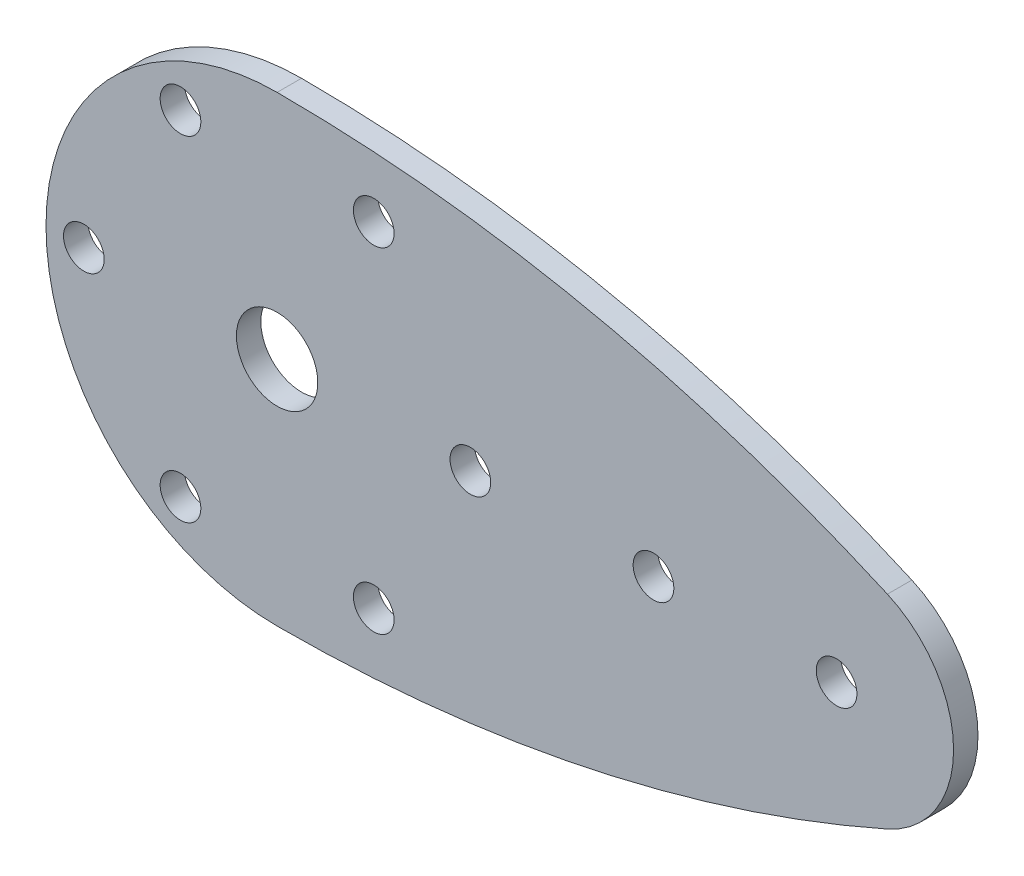
ISO-10303-21;
HEADER;
FILE_DESCRIPTION(('STEP AP214'),'2;1');
FILE_NAME('part.step','',(''),(''),'','','');
FILE_SCHEMA(('AUTOMOTIVE_DESIGN { 1 0 10303 214 1 1 1 1 }'));
ENDSEC;
DATA;
#1=APPLICATION_CONTEXT('core data for automotive mechanical design processes');
#2=APPLICATION_PROTOCOL_DEFINITION('international standard','automotive_design',2000,#1);
#3=PRODUCT_CONTEXT('',#1,'mechanical');
#4=PRODUCT('Part','Part','',(#3));
#5=PRODUCT_RELATED_PRODUCT_CATEGORY('part','',(#4));
#6=PRODUCT_DEFINITION_FORMATION('','',#4);
#7=PRODUCT_DEFINITION_CONTEXT('part definition',#1,'design');
#8=PRODUCT_DEFINITION('design','',#6,#7);
#9=PRODUCT_DEFINITION_SHAPE('','',#8);
#10=(LENGTH_UNIT() NAMED_UNIT(*) SI_UNIT(.MILLI.,.METRE.));
#11=(NAMED_UNIT(*) PLANE_ANGLE_UNIT() SI_UNIT($,.RADIAN.));
#12=(NAMED_UNIT(*) SI_UNIT($,.STERADIAN.) SOLID_ANGLE_UNIT());
#13=UNCERTAINTY_MEASURE_WITH_UNIT(LENGTH_MEASURE(1.E-05),#10,'distance_accuracy_value','');
#14=(GEOMETRIC_REPRESENTATION_CONTEXT(3) GLOBAL_UNCERTAINTY_ASSIGNED_CONTEXT((#13)) GLOBAL_UNIT_ASSIGNED_CONTEXT((#10,
#11,#12)) REPRESENTATION_CONTEXT('',''));
#15=CARTESIAN_POINT('',(0.,0.,0.));
#16=DIRECTION('',(0.,0.,1.));
#17=DIRECTION('',(1.,0.,0.));
#18=AXIS2_PLACEMENT_3D('',#15,#16,#17);
#19=CARTESIAN_POINT('',(27.3635313531353,0.,-0.5));
#20=DIRECTION('',(0.,0.,-1.));
#21=DIRECTION('',(-1.,0.,0.));
#22=AXIS2_PLACEMENT_3D('',#19,#20,#21);
#23=PLANE('',#22);
#24=CARTESIAN_POINT('',(68.75,0.,-0.5));
#25=DIRECTION('',(0.,0.,-1.));
#26=DIRECTION('',(-1.,0.,0.));
#27=AXIS2_PLACEMENT_3D('',#24,#25,#26);
#28=CIRCLE('',#27,2.5);
#29=CARTESIAN_POINT('',(66.25,0.,-0.5));
#30=VERTEX_POINT('',#29);
#31=EDGE_CURVE('E110',#30,#30,#28,.F.);
#32=ORIENTED_EDGE('',*,*,#31,.T.);
#33=EDGE_LOOP('',(#32));
#34=FACE_BOUND('',#33,.T.);
#35=CARTESIAN_POINT('',(11.875,20.5681033398804,-0.5));
#36=DIRECTION('',(0.,0.,-1.));
#37=DIRECTION('',(-1.,0.,0.));
#38=AXIS2_PLACEMENT_3D('',#35,#36,#37);
#39=CIRCLE('',#38,2.5);
#40=CARTESIAN_POINT('',(9.375,20.5681033398804,-0.5));
#41=VERTEX_POINT('',#40);
#42=EDGE_CURVE('E113',#41,#41,#39,.F.);
#43=ORIENTED_EDGE('',*,*,#42,.T.);
#44=EDGE_LOOP('',(#43));
#45=FACE_BOUND('',#44,.T.);
#46=CARTESIAN_POINT('',(-23.75,0.,-0.5));
#47=DIRECTION('',(0.,0.,-1.));
#48=DIRECTION('',(-1.,0.,0.));
#49=AXIS2_PLACEMENT_3D('',#46,#47,#48);
#50=CIRCLE('',#49,2.5);
#51=CARTESIAN_POINT('',(-26.25,0.,-0.5));
#52=VERTEX_POINT('',#51);
#53=EDGE_CURVE('E116',#52,#52,#50,.F.);
#54=ORIENTED_EDGE('',*,*,#53,.T.);
#55=EDGE_LOOP('',(#54));
#56=FACE_BOUND('',#55,.T.);
#57=CARTESIAN_POINT('',(-11.875,-20.5681033398804,-0.5));
#58=DIRECTION('',(0.,0.,-1.));
#59=DIRECTION('',(-1.,0.,0.));
#60=AXIS2_PLACEMENT_3D('',#57,#58,#59);
#61=CIRCLE('',#60,2.5);
#62=CARTESIAN_POINT('',(-14.375,-20.5681033398804,-0.5));
#63=VERTEX_POINT('',#62);
#64=EDGE_CURVE('E119',#63,#63,#61,.F.);
#65=ORIENTED_EDGE('',*,*,#64,.T.);
#66=EDGE_LOOP('',(#65));
#67=FACE_BOUND('',#66,.T.);
#68=CARTESIAN_POINT('',(46.25,0.,-0.5));
#69=DIRECTION('',(0.,0.,-1.));
#70=DIRECTION('',(-1.,0.,0.));
#71=AXIS2_PLACEMENT_3D('',#68,#69,#70);
#72=CIRCLE('',#71,2.5);
#73=CARTESIAN_POINT('',(43.75,0.,-0.5));
#74=VERTEX_POINT('',#73);
#75=EDGE_CURVE('E122',#74,#74,#72,.F.);
#76=ORIENTED_EDGE('',*,*,#75,.T.);
#77=EDGE_LOOP('',(#76));
#78=FACE_BOUND('',#77,.T.);
#79=CARTESIAN_POINT('',(-11.875,20.5681033398804,-0.5));
#80=DIRECTION('',(0.,0.,-1.));
#81=DIRECTION('',(-1.,0.,0.));
#82=AXIS2_PLACEMENT_3D('',#79,#80,#81);
#83=CIRCLE('',#82,2.5);
#84=CARTESIAN_POINT('',(-14.375,20.5681033398804,-0.5));
#85=VERTEX_POINT('',#84);
#86=EDGE_CURVE('E125',#85,#85,#83,.F.);
#87=ORIENTED_EDGE('',*,*,#86,.T.);
#88=EDGE_LOOP('',(#87));
#89=FACE_BOUND('',#88,.T.);
#90=CARTESIAN_POINT('',(11.875,-20.5681033398804,-0.5));
#91=DIRECTION('',(0.,0.,-1.));
#92=DIRECTION('',(-1.,0.,0.));
#93=AXIS2_PLACEMENT_3D('',#90,#91,#92);
#94=CIRCLE('',#93,2.5);
#95=CARTESIAN_POINT('',(9.375,-20.5681033398804,-0.5));
#96=VERTEX_POINT('',#95);
#97=EDGE_CURVE('E128',#96,#96,#94,.F.);
#98=ORIENTED_EDGE('',*,*,#97,.T.);
#99=EDGE_LOOP('',(#98));
#100=FACE_BOUND('',#99,.T.);
#101=CARTESIAN_POINT('',(23.75,0.,-0.5));
#102=DIRECTION('',(0.,0.,-1.));
#103=DIRECTION('',(-1.,0.,0.));
#104=AXIS2_PLACEMENT_3D('',#101,#102,#103);
#105=CIRCLE('',#104,2.5);
#106=CARTESIAN_POINT('',(21.25,0.,-0.5));
#107=VERTEX_POINT('',#106);
#108=EDGE_CURVE('E131',#107,#107,#105,.F.);
#109=ORIENTED_EDGE('',*,*,#108,.T.);
#110=EDGE_LOOP('',(#109));
#111=FACE_BOUND('',#110,.T.);
#112=CARTESIAN_POINT('',(0.,0.,-0.5));
#113=DIRECTION('',(0.,0.,-1.));
#114=DIRECTION('',(-1.,0.,0.));
#115=AXIS2_PLACEMENT_3D('',#112,#113,#114);
#116=CIRCLE('',#115,5.);
#117=CARTESIAN_POINT('',(-5.,0.,-0.5));
#118=VERTEX_POINT('',#117);
#119=EDGE_CURVE('E134',#118,#118,#116,.F.);
#120=ORIENTED_EDGE('',*,*,#119,.T.);
#121=EDGE_LOOP('',(#120));
#122=FACE_BOUND('',#121,.T.);
#123=CARTESIAN_POINT('',(69.4505871906988,0.,-0.5));
#124=DIRECTION('',(0.,0.,-1.));
#125=DIRECTION('',(-1.,0.,0.));
#126=AXIS2_PLACEMENT_3D('',#123,#124,#125);
#127=CIRCLE('',#126,13.6764755155719);
#128=CARTESIAN_POINT('',(75.,-12.5000000000001,-0.5));
#129=VERTEX_POINT('',#128);
#130=CARTESIAN_POINT('',(75.,12.5,-0.5));
#131=VERTEX_POINT('',#130);
#132=EDGE_CURVE('E54',#129,#131,#127,.F.);
#133=ORIENTED_EDGE('',*,*,#132,.F.);
#134=CARTESIAN_POINT('',(0.,156.43679245283,-0.5));
#135=DIRECTION('',(0.,0.,-1.));
#136=DIRECTION('',(-1.,0.,0.));
#137=AXIS2_PLACEMENT_3D('',#134,#135,#136);
#138=CIRCLE('',#137,184.83679245283);
#139=CARTESIAN_POINT('',(0.,-28.4,-0.5));
#140=VERTEX_POINT('',#139);
#141=EDGE_CURVE('E73',#140,#129,#138,.F.);
#142=ORIENTED_EDGE('',*,*,#141,.F.);
#143=CARTESIAN_POINT('',(0.,0.,-0.5));
#144=DIRECTION('',(0.,0.,-1.));
#145=DIRECTION('',(-1.,0.,0.));
#146=AXIS2_PLACEMENT_3D('',#143,#144,#145);
#147=CIRCLE('',#146,28.4);
#148=CARTESIAN_POINT('',(0.,28.4,-0.5));
#149=VERTEX_POINT('',#148);
#150=EDGE_CURVE('E66',#149,#140,#147,.F.);
#151=ORIENTED_EDGE('',*,*,#150,.F.);
#152=CARTESIAN_POINT('',(0.,-156.43679245283,-0.5));
#153=DIRECTION('',(0.,0.,-1.));
#154=DIRECTION('',(-1.,0.,0.));
#155=AXIS2_PLACEMENT_3D('',#152,#153,#154);
#156=CIRCLE('',#155,184.83679245283);
#157=EDGE_CURVE('E19',#131,#149,#156,.F.);
#158=ORIENTED_EDGE('',*,*,#157,.F.);
#159=EDGE_LOOP('',(#133,#142,#151,#158));
#160=FACE_BOUND('',#159,.T.);
#161=ADVANCED_FACE('F16',(#34,#45,#56,#67,#78,#89,#100,#111,#122,#160),#23,.T.);
#162=CARTESIAN_POINT('',(0.,-156.43679245283,2.5));
#163=DIRECTION('',(0.,0.,-1.));
#164=DIRECTION('',(-1.,0.,0.));
#165=AXIS2_PLACEMENT_3D('',#162,#163,#164);
#166=CYLINDRICAL_SURFACE('',#165,184.83679245283);
#167=ORIENTED_EDGE('',*,*,#157,.T.);
#168=DIRECTION('',(0.,0.,-1.));
#169=VECTOR('',#168,1.);
#170=CARTESIAN_POINT('',(0.,28.4,2.5));
#171=LINE('',#170,#169);
#172=CARTESIAN_POINT('',(0.,28.4,2.5));
#173=VERTEX_POINT('',#172);
#174=EDGE_CURVE('E137',#173,#149,#171,.T.);
#175=ORIENTED_EDGE('',*,*,#174,.F.);
#176=CARTESIAN_POINT('',(0.,-156.43679245283,2.5));
#177=DIRECTION('',(0.,0.,-1.));
#178=DIRECTION('',(-1.,0.,0.));
#179=AXIS2_PLACEMENT_3D('',#176,#177,#178);
#180=CIRCLE('',#179,184.83679245283);
#181=CARTESIAN_POINT('',(75.,12.5,2.5));
#182=VERTEX_POINT('',#181);
#183=EDGE_CURVE('E72',#173,#182,#180,.T.);
#184=ORIENTED_EDGE('',*,*,#183,.T.);
#185=DIRECTION('',(0.,0.,-1.));
#186=VECTOR('',#185,1.);
#187=CARTESIAN_POINT('',(75.,12.5,2.5));
#188=LINE('',#187,#186);
#189=EDGE_CURVE('E59',#131,#182,#188,.F.);
#190=ORIENTED_EDGE('',*,*,#189,.F.);
#191=EDGE_LOOP('',(#167,#175,#184,#190));
#192=FACE_BOUND('',#191,.T.);
#193=ADVANCED_FACE('F71',(#192),#166,.T.);
#194=CARTESIAN_POINT('',(69.4505871906988,0.,2.5));
#195=DIRECTION('',(0.,0.,-1.));
#196=DIRECTION('',(-1.,0.,0.));
#197=AXIS2_PLACEMENT_3D('',#194,#195,#196);
#198=CYLINDRICAL_SURFACE('',#197,13.6764755155719);
#199=ORIENTED_EDGE('',*,*,#132,.T.);
#200=ORIENTED_EDGE('',*,*,#189,.T.);
#201=CARTESIAN_POINT('',(69.4505871906988,0.,2.5));
#202=DIRECTION('',(0.,0.,-1.));
#203=DIRECTION('',(-1.,0.,0.));
#204=AXIS2_PLACEMENT_3D('',#201,#202,#203);
#205=CIRCLE('',#204,13.6764755155719);
#206=CARTESIAN_POINT('',(75.,-12.5000000000001,2.5));
#207=VERTEX_POINT('',#206);
#208=EDGE_CURVE('E107',#182,#207,#205,.T.);
#209=ORIENTED_EDGE('',*,*,#208,.T.);
#210=DIRECTION('',(0.,0.,-1.));
#211=VECTOR('',#210,1.);
#212=CARTESIAN_POINT('',(75.,-12.5000000000001,2.5));
#213=LINE('',#212,#211);
#214=EDGE_CURVE('E61',#129,#207,#213,.F.);
#215=ORIENTED_EDGE('',*,*,#214,.F.);
#216=EDGE_LOOP('',(#199,#200,#209,#215));
#217=FACE_BOUND('',#216,.T.);
#218=ADVANCED_FACE('F56',(#217),#198,.T.);
#219=CARTESIAN_POINT('',(0.,156.43679245283,2.5));
#220=DIRECTION('',(0.,0.,-1.));
#221=DIRECTION('',(-1.,0.,0.));
#222=AXIS2_PLACEMENT_3D('',#219,#220,#221);
#223=CYLINDRICAL_SURFACE('',#222,184.83679245283);
#224=ORIENTED_EDGE('',*,*,#141,.T.);
#225=ORIENTED_EDGE('',*,*,#214,.T.);
#226=CARTESIAN_POINT('',(0.,156.43679245283,2.5));
#227=DIRECTION('',(0.,0.,-1.));
#228=DIRECTION('',(-1.,0.,0.));
#229=AXIS2_PLACEMENT_3D('',#226,#227,#228);
#230=CIRCLE('',#229,184.83679245283);
#231=CARTESIAN_POINT('',(0.,-28.4,2.5));
#232=VERTEX_POINT('',#231);
#233=EDGE_CURVE('E104',#207,#232,#230,.T.);
#234=ORIENTED_EDGE('',*,*,#233,.T.);
#235=DIRECTION('',(0.,0.,-1.));
#236=VECTOR('',#235,1.);
#237=CARTESIAN_POINT('',(0.,-28.4,2.5));
#238=LINE('',#237,#236);
#239=EDGE_CURVE('E34',#140,#232,#238,.F.);
#240=ORIENTED_EDGE('',*,*,#239,.F.);
#241=EDGE_LOOP('',(#224,#225,#234,#240));
#242=FACE_BOUND('',#241,.T.);
#243=ADVANCED_FACE('F141',(#242),#223,.T.);
#244=CARTESIAN_POINT('',(0.,0.,2.5));
#245=DIRECTION('',(0.,0.,-1.));
#246=DIRECTION('',(-1.,0.,0.));
#247=AXIS2_PLACEMENT_3D('',#244,#245,#246);
#248=CYLINDRICAL_SURFACE('',#247,28.4);
#249=ORIENTED_EDGE('',*,*,#150,.T.);
#250=ORIENTED_EDGE('',*,*,#239,.T.);
#251=CARTESIAN_POINT('',(0.,0.,2.5));
#252=DIRECTION('',(0.,0.,-1.));
#253=DIRECTION('',(-1.,0.,0.));
#254=AXIS2_PLACEMENT_3D('',#251,#252,#253);
#255=CIRCLE('',#254,28.4);
#256=EDGE_CURVE('E102',#232,#173,#255,.T.);
#257=ORIENTED_EDGE('',*,*,#256,.T.);
#258=ORIENTED_EDGE('',*,*,#174,.T.);
#259=EDGE_LOOP('',(#249,#250,#257,#258));
#260=FACE_BOUND('',#259,.T.);
#261=ADVANCED_FACE('F144',(#260),#248,.T.);
#262=CARTESIAN_POINT('',(0.,0.,2.5));
#263=DIRECTION('',(0.,0.,-1.));
#264=DIRECTION('',(-1.,0.,0.));
#265=AXIS2_PLACEMENT_3D('',#262,#263,#264);
#266=CYLINDRICAL_SURFACE('',#265,5.);
#267=CARTESIAN_POINT('',(0.,0.,2.5));
#268=DIRECTION('',(0.,0.,-1.));
#269=DIRECTION('',(-1.,0.,0.));
#270=AXIS2_PLACEMENT_3D('',#267,#268,#269);
#271=CIRCLE('',#270,5.);
#272=CARTESIAN_POINT('',(-5.,0.,2.5));
#273=VERTEX_POINT('',#272);
#274=EDGE_CURVE('E99',#273,#273,#271,.F.);
#275=ORIENTED_EDGE('',*,*,#274,.T.);
#276=EDGE_LOOP('',(#275));
#277=FACE_BOUND('',#276,.T.);
#278=ORIENTED_EDGE('',*,*,#119,.F.);
#279=EDGE_LOOP('',(#278));
#280=FACE_BOUND('',#279,.T.);
#281=ADVANCED_FACE('F146',(#277,#280),#266,.F.);
#282=CARTESIAN_POINT('',(23.75,0.,2.5));
#283=DIRECTION('',(0.,0.,-1.));
#284=DIRECTION('',(-1.,0.,0.));
#285=AXIS2_PLACEMENT_3D('',#282,#283,#284);
#286=CYLINDRICAL_SURFACE('',#285,2.5);
#287=CARTESIAN_POINT('',(23.75,0.,2.5));
#288=DIRECTION('',(0.,0.,-1.));
#289=DIRECTION('',(-1.,0.,0.));
#290=AXIS2_PLACEMENT_3D('',#287,#288,#289);
#291=CIRCLE('',#290,2.5);
#292=CARTESIAN_POINT('',(21.25,0.,2.5));
#293=VERTEX_POINT('',#292);
#294=EDGE_CURVE('E96',#293,#293,#291,.F.);
#295=ORIENTED_EDGE('',*,*,#294,.T.);
#296=EDGE_LOOP('',(#295));
#297=FACE_BOUND('',#296,.T.);
#298=ORIENTED_EDGE('',*,*,#108,.F.);
#299=EDGE_LOOP('',(#298));
#300=FACE_BOUND('',#299,.T.);
#301=ADVANCED_FACE('F153',(#297,#300),#286,.F.);
#302=CARTESIAN_POINT('',(11.875,-20.5681033398804,2.5));
#303=DIRECTION('',(0.,0.,-1.));
#304=DIRECTION('',(-1.,0.,0.));
#305=AXIS2_PLACEMENT_3D('',#302,#303,#304);
#306=CYLINDRICAL_SURFACE('',#305,2.5);
#307=CARTESIAN_POINT('',(11.875,-20.5681033398804,2.5));
#308=DIRECTION('',(0.,0.,-1.));
#309=DIRECTION('',(-1.,0.,0.));
#310=AXIS2_PLACEMENT_3D('',#307,#308,#309);
#311=CIRCLE('',#310,2.5);
#312=CARTESIAN_POINT('',(9.375,-20.5681033398804,2.5));
#313=VERTEX_POINT('',#312);
#314=EDGE_CURVE('E93',#313,#313,#311,.F.);
#315=ORIENTED_EDGE('',*,*,#314,.T.);
#316=EDGE_LOOP('',(#315));
#317=FACE_BOUND('',#316,.T.);
#318=ORIENTED_EDGE('',*,*,#97,.F.);
#319=EDGE_LOOP('',(#318));
#320=FACE_BOUND('',#319,.T.);
#321=ADVANCED_FACE('F188',(#317,#320),#306,.F.);
#322=CARTESIAN_POINT('',(-11.875,20.5681033398804,2.5));
#323=DIRECTION('',(0.,0.,-1.));
#324=DIRECTION('',(-1.,0.,0.));
#325=AXIS2_PLACEMENT_3D('',#322,#323,#324);
#326=CYLINDRICAL_SURFACE('',#325,2.5);
#327=CARTESIAN_POINT('',(-11.875,20.5681033398804,2.5));
#328=DIRECTION('',(0.,0.,-1.));
#329=DIRECTION('',(-1.,0.,0.));
#330=AXIS2_PLACEMENT_3D('',#327,#328,#329);
#331=CIRCLE('',#330,2.5);
#332=CARTESIAN_POINT('',(-14.375,20.5681033398804,2.5));
#333=VERTEX_POINT('',#332);
#334=EDGE_CURVE('E90',#333,#333,#331,.F.);
#335=ORIENTED_EDGE('',*,*,#334,.T.);
#336=EDGE_LOOP('',(#335));
#337=FACE_BOUND('',#336,.T.);
#338=ORIENTED_EDGE('',*,*,#86,.F.);
#339=EDGE_LOOP('',(#338));
#340=FACE_BOUND('',#339,.T.);
#341=ADVANCED_FACE('F184',(#337,#340),#326,.F.);
#342=CARTESIAN_POINT('',(46.25,0.,2.5));
#343=DIRECTION('',(0.,0.,-1.));
#344=DIRECTION('',(-1.,0.,0.));
#345=AXIS2_PLACEMENT_3D('',#342,#343,#344);
#346=CYLINDRICAL_SURFACE('',#345,2.5);
#347=CARTESIAN_POINT('',(46.25,0.,2.5));
#348=DIRECTION('',(0.,0.,-1.));
#349=DIRECTION('',(-1.,0.,0.));
#350=AXIS2_PLACEMENT_3D('',#347,#348,#349);
#351=CIRCLE('',#350,2.5);
#352=CARTESIAN_POINT('',(43.75,0.,2.5));
#353=VERTEX_POINT('',#352);
#354=EDGE_CURVE('E87',#353,#353,#351,.F.);
#355=ORIENTED_EDGE('',*,*,#354,.T.);
#356=EDGE_LOOP('',(#355));
#357=FACE_BOUND('',#356,.T.);
#358=ORIENTED_EDGE('',*,*,#75,.F.);
#359=EDGE_LOOP('',(#358));
#360=FACE_BOUND('',#359,.T.);
#361=ADVANCED_FACE('F180',(#357,#360),#346,.F.);
#362=CARTESIAN_POINT('',(-11.875,-20.5681033398804,2.5));
#363=DIRECTION('',(0.,0.,-1.));
#364=DIRECTION('',(-1.,0.,0.));
#365=AXIS2_PLACEMENT_3D('',#362,#363,#364);
#366=CYLINDRICAL_SURFACE('',#365,2.5);
#367=CARTESIAN_POINT('',(-11.875,-20.5681033398804,2.5));
#368=DIRECTION('',(0.,0.,-1.));
#369=DIRECTION('',(-1.,0.,0.));
#370=AXIS2_PLACEMENT_3D('',#367,#368,#369);
#371=CIRCLE('',#370,2.5);
#372=CARTESIAN_POINT('',(-14.375,-20.5681033398804,2.5));
#373=VERTEX_POINT('',#372);
#374=EDGE_CURVE('E84',#373,#373,#371,.F.);
#375=ORIENTED_EDGE('',*,*,#374,.T.);
#376=EDGE_LOOP('',(#375));
#377=FACE_BOUND('',#376,.T.);
#378=ORIENTED_EDGE('',*,*,#64,.F.);
#379=EDGE_LOOP('',(#378));
#380=FACE_BOUND('',#379,.T.);
#381=ADVANCED_FACE('F176',(#377,#380),#366,.F.);
#382=CARTESIAN_POINT('',(-23.75,0.,2.5));
#383=DIRECTION('',(0.,0.,-1.));
#384=DIRECTION('',(-1.,0.,0.));
#385=AXIS2_PLACEMENT_3D('',#382,#383,#384);
#386=CYLINDRICAL_SURFACE('',#385,2.5);
#387=CARTESIAN_POINT('',(-23.75,0.,2.5));
#388=DIRECTION('',(0.,0.,-1.));
#389=DIRECTION('',(-1.,0.,0.));
#390=AXIS2_PLACEMENT_3D('',#387,#388,#389);
#391=CIRCLE('',#390,2.5);
#392=CARTESIAN_POINT('',(-26.25,0.,2.5));
#393=VERTEX_POINT('',#392);
#394=EDGE_CURVE('E81',#393,#393,#391,.F.);
#395=ORIENTED_EDGE('',*,*,#394,.T.);
#396=EDGE_LOOP('',(#395));
#397=FACE_BOUND('',#396,.T.);
#398=ORIENTED_EDGE('',*,*,#53,.F.);
#399=EDGE_LOOP('',(#398));
#400=FACE_BOUND('',#399,.T.);
#401=ADVANCED_FACE('F172',(#397,#400),#386,.F.);
#402=CARTESIAN_POINT('',(11.875,20.5681033398804,2.5));
#403=DIRECTION('',(0.,0.,-1.));
#404=DIRECTION('',(-1.,0.,0.));
#405=AXIS2_PLACEMENT_3D('',#402,#403,#404);
#406=CYLINDRICAL_SURFACE('',#405,2.5);
#407=CARTESIAN_POINT('',(11.875,20.5681033398804,2.5));
#408=DIRECTION('',(0.,0.,-1.));
#409=DIRECTION('',(-1.,0.,0.));
#410=AXIS2_PLACEMENT_3D('',#407,#408,#409);
#411=CIRCLE('',#410,2.5);
#412=CARTESIAN_POINT('',(9.375,20.5681033398804,2.5));
#413=VERTEX_POINT('',#412);
#414=EDGE_CURVE('E25',#413,#413,#411,.F.);
#415=ORIENTED_EDGE('',*,*,#414,.T.);
#416=EDGE_LOOP('',(#415));
#417=FACE_BOUND('',#416,.T.);
#418=ORIENTED_EDGE('',*,*,#42,.F.);
#419=EDGE_LOOP('',(#418));
#420=FACE_BOUND('',#419,.T.);
#421=ADVANCED_FACE('F164',(#417,#420),#406,.F.);
#422=CARTESIAN_POINT('',(68.75,0.,2.5));
#423=DIRECTION('',(0.,0.,-1.));
#424=DIRECTION('',(-1.,0.,0.));
#425=AXIS2_PLACEMENT_3D('',#422,#423,#424);
#426=CYLINDRICAL_SURFACE('',#425,2.5);
#427=CARTESIAN_POINT('',(68.75,0.,2.5));
#428=DIRECTION('',(0.,0.,-1.));
#429=DIRECTION('',(-1.,0.,0.));
#430=AXIS2_PLACEMENT_3D('',#427,#428,#429);
#431=CIRCLE('',#430,2.5);
#432=CARTESIAN_POINT('',(66.25,0.,2.5));
#433=VERTEX_POINT('',#432);
#434=EDGE_CURVE('E11',#433,#433,#431,.F.);
#435=ORIENTED_EDGE('',*,*,#434,.T.);
#436=EDGE_LOOP('',(#435));
#437=FACE_BOUND('',#436,.T.);
#438=ORIENTED_EDGE('',*,*,#31,.F.);
#439=EDGE_LOOP('',(#438));
#440=FACE_BOUND('',#439,.T.);
#441=ADVANCED_FACE('F158',(#437,#440),#426,.F.);
#442=CARTESIAN_POINT('',(27.3635313531353,0.,2.5));
#443=DIRECTION('',(0.,0.,-1.));
#444=DIRECTION('',(-1.,0.,0.));
#445=AXIS2_PLACEMENT_3D('',#442,#443,#444);
#446=PLANE('',#445);
#447=ORIENTED_EDGE('',*,*,#434,.F.);
#448=EDGE_LOOP('',(#447));
#449=FACE_BOUND('',#448,.T.);
#450=ORIENTED_EDGE('',*,*,#414,.F.);
#451=EDGE_LOOP('',(#450));
#452=FACE_BOUND('',#451,.T.);
#453=ORIENTED_EDGE('',*,*,#394,.F.);
#454=EDGE_LOOP('',(#453));
#455=FACE_BOUND('',#454,.T.);
#456=ORIENTED_EDGE('',*,*,#374,.F.);
#457=EDGE_LOOP('',(#456));
#458=FACE_BOUND('',#457,.T.);
#459=ORIENTED_EDGE('',*,*,#354,.F.);
#460=EDGE_LOOP('',(#459));
#461=FACE_BOUND('',#460,.T.);
#462=ORIENTED_EDGE('',*,*,#334,.F.);
#463=EDGE_LOOP('',(#462));
#464=FACE_BOUND('',#463,.T.);
#465=ORIENTED_EDGE('',*,*,#314,.F.);
#466=EDGE_LOOP('',(#465));
#467=FACE_BOUND('',#466,.T.);
#468=ORIENTED_EDGE('',*,*,#294,.F.);
#469=EDGE_LOOP('',(#468));
#470=FACE_BOUND('',#469,.T.);
#471=ORIENTED_EDGE('',*,*,#274,.F.);
#472=EDGE_LOOP('',(#471));
#473=FACE_BOUND('',#472,.T.);
#474=ORIENTED_EDGE('',*,*,#233,.F.);
#475=ORIENTED_EDGE('',*,*,#208,.F.);
#476=ORIENTED_EDGE('',*,*,#183,.F.);
#477=ORIENTED_EDGE('',*,*,#256,.F.);
#478=EDGE_LOOP('',(#474,#475,#476,#477));
#479=FACE_BOUND('',#478,.T.);
#480=ADVANCED_FACE('F143',(#449,#452,#455,#458,#461,#464,#467,#470,#473,#479),#446,.F.);
#481=CLOSED_SHELL('',(#161,#193,#218,#243,#261,#281,#301,#321,#341,#361,#381,#401,#421,#441,#480));
#482=MANIFOLD_SOLID_BREP('B1',#481);
#483=ADVANCED_BREP_SHAPE_REPRESENTATION('',(#18,#482),#14);
#484=SHAPE_DEFINITION_REPRESENTATION(#9,#483);
ENDSEC;
END-ISO-10303-21;
